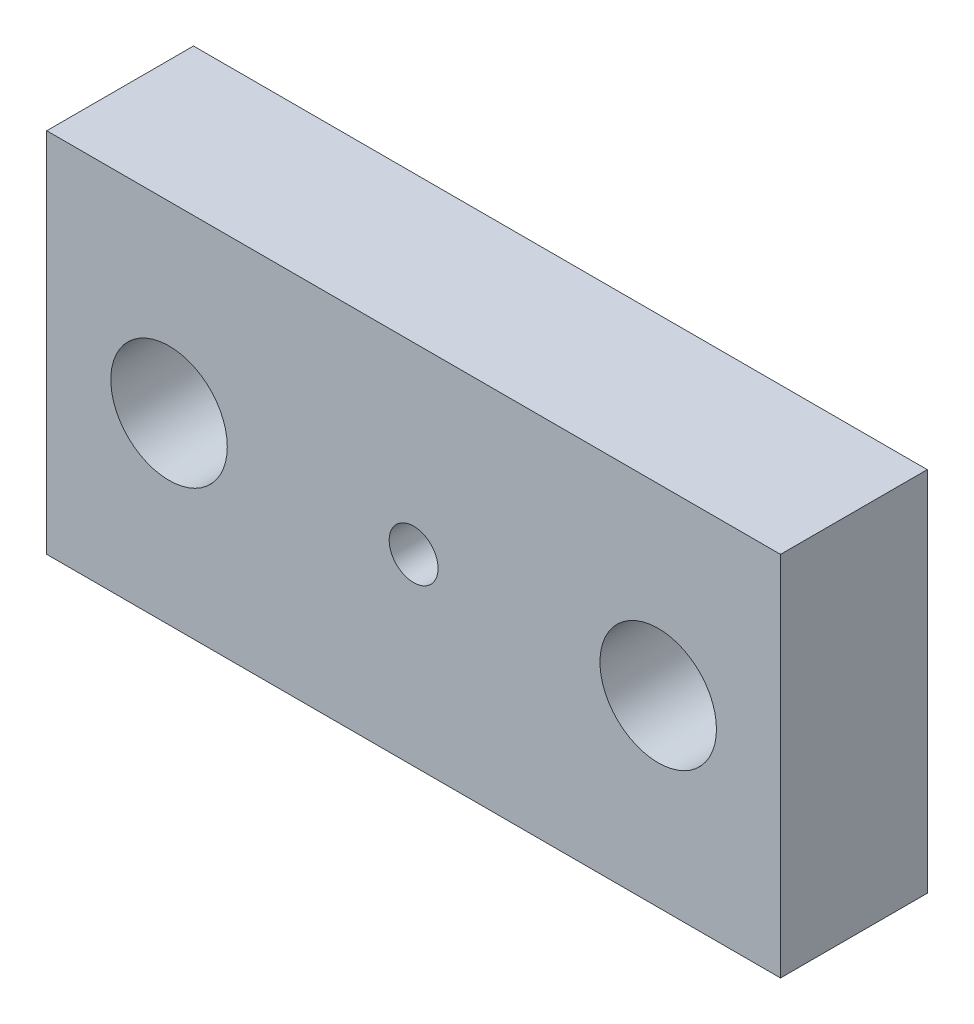
ISO-10303-21;
HEADER;
FILE_DESCRIPTION(('STEP AP214'),'2;1');
FILE_NAME('part.step','',(''),(''),'','','');
FILE_SCHEMA(('AUTOMOTIVE_DESIGN { 1 0 10303 214 1 1 1 1 }'));
ENDSEC;
DATA;
#1=APPLICATION_CONTEXT('core data for automotive mechanical design processes');
#2=APPLICATION_PROTOCOL_DEFINITION('international standard','automotive_design',2000,#1);
#3=PRODUCT_CONTEXT('',#1,'mechanical');
#4=PRODUCT('Part','Part','',(#3));
#5=PRODUCT_RELATED_PRODUCT_CATEGORY('part','',(#4));
#6=PRODUCT_DEFINITION_FORMATION('','',#4);
#7=PRODUCT_DEFINITION_CONTEXT('part definition',#1,'design');
#8=PRODUCT_DEFINITION('design','',#6,#7);
#9=PRODUCT_DEFINITION_SHAPE('','',#8);
#10=(LENGTH_UNIT() NAMED_UNIT(*) SI_UNIT(.MILLI.,.METRE.));
#11=(NAMED_UNIT(*) PLANE_ANGLE_UNIT() SI_UNIT($,.RADIAN.));
#12=(NAMED_UNIT(*) SI_UNIT($,.STERADIAN.) SOLID_ANGLE_UNIT());
#13=UNCERTAINTY_MEASURE_WITH_UNIT(LENGTH_MEASURE(1.E-05),#10,'distance_accuracy_value','');
#14=(GEOMETRIC_REPRESENTATION_CONTEXT(3) GLOBAL_UNCERTAINTY_ASSIGNED_CONTEXT((#13)) GLOBAL_UNIT_ASSIGNED_CONTEXT((#10,
#11,#12)) REPRESENTATION_CONTEXT('',''));
#15=CARTESIAN_POINT('',(0.,0.,0.));
#16=DIRECTION('',(0.,0.,1.));
#17=DIRECTION('',(1.,0.,0.));
#18=AXIS2_PLACEMENT_3D('',#15,#16,#17);
#19=CARTESIAN_POINT('',(0.,0.,6.));
#20=DIRECTION('',(0.,0.,-1.));
#21=DIRECTION('',(-1.,0.,0.));
#22=AXIS2_PLACEMENT_3D('',#19,#20,#21);
#23=CYLINDRICAL_SURFACE('',#22,1.);
#24=CARTESIAN_POINT('',(0.,0.,6.));
#25=DIRECTION('',(0.,0.,1.));
#26=DIRECTION('',(1.,0.,0.));
#27=AXIS2_PLACEMENT_3D('',#24,#25,#26);
#28=CIRCLE('',#27,1.);
#29=CARTESIAN_POINT('',(0.999999999999993,0.,6.));
#30=VERTEX_POINT('',#29);
#31=EDGE_CURVE('E106',#30,#30,#28,.T.);
#32=ORIENTED_EDGE('',*,*,#31,.T.);
#33=EDGE_LOOP('',(#32));
#34=FACE_BOUND('',#33,.T.);
#35=CARTESIAN_POINT('',(0.,0.,3.));
#36=DIRECTION('',(0.,0.,-1.));
#37=DIRECTION('',(-1.,0.,0.));
#38=AXIS2_PLACEMENT_3D('',#35,#36,#37);
#39=CIRCLE('',#38,1.);
#40=CARTESIAN_POINT('',(-1.00000000000001,0.,3.));
#41=VERTEX_POINT('',#40);
#42=EDGE_CURVE('E40',#41,#41,#39,.T.);
#43=ORIENTED_EDGE('',*,*,#42,.T.);
#44=EDGE_LOOP('',(#43));
#45=FACE_BOUND('',#44,.T.);
#46=ADVANCED_FACE('F36',(#34,#45),#23,.F.);
#47=CARTESIAN_POINT('',(0.,0.,6.));
#48=DIRECTION('',(0.,0.,-1.));
#49=DIRECTION('',(-1.,0.,0.));
#50=AXIS2_PLACEMENT_3D('',#47,#48,#49);
#51=PLANE('',#50);
#52=DIRECTION('',(0.,1.,0.));
#53=VECTOR('',#52,1.);
#54=CARTESIAN_POINT('',(15.,-7.5,6.));
#55=LINE('',#54,#53);
#56=CARTESIAN_POINT('',(15.,-7.5,6.));
#57=VERTEX_POINT('',#56);
#58=CARTESIAN_POINT('',(15.,7.5,6.));
#59=VERTEX_POINT('',#58);
#60=EDGE_CURVE('E90',#57,#59,#55,.T.);
#61=ORIENTED_EDGE('',*,*,#60,.T.);
#62=DIRECTION('',(-1.,0.,0.));
#63=VECTOR('',#62,1.);
#64=CARTESIAN_POINT('',(-15.,7.5,6.));
#65=LINE('',#64,#63);
#66=CARTESIAN_POINT('',(-15.,7.5,6.));
#67=VERTEX_POINT('',#66);
#68=EDGE_CURVE('E84',#59,#67,#65,.T.);
#69=ORIENTED_EDGE('',*,*,#68,.T.);
#70=DIRECTION('',(0.,-1.,0.));
#71=VECTOR('',#70,1.);
#72=CARTESIAN_POINT('',(-15.,-7.5,6.));
#73=LINE('',#72,#71);
#74=CARTESIAN_POINT('',(-15.,-7.5,6.));
#75=VERTEX_POINT('',#74);
#76=EDGE_CURVE('E88',#67,#75,#73,.T.);
#77=ORIENTED_EDGE('',*,*,#76,.T.);
#78=DIRECTION('',(1.,0.,0.));
#79=VECTOR('',#78,1.);
#80=CARTESIAN_POINT('',(-15.,-7.5,6.));
#81=LINE('',#80,#79);
#82=EDGE_CURVE('E54',#75,#57,#81,.T.);
#83=ORIENTED_EDGE('',*,*,#82,.T.);
#84=EDGE_LOOP('',(#61,#69,#77,#83));
#85=FACE_BOUND('',#84,.T.);
#86=ORIENTED_EDGE('',*,*,#31,.F.);
#87=EDGE_LOOP('',(#86));
#88=FACE_BOUND('',#87,.T.);
#89=CARTESIAN_POINT('',(10.,0.,6.));
#90=DIRECTION('',(0.,0.,1.));
#91=DIRECTION('',(1.,0.,0.));
#92=AXIS2_PLACEMENT_3D('',#89,#90,#91);
#93=CIRCLE('',#92,2.38125);
#94=CARTESIAN_POINT('',(12.38125,0.,6.));
#95=VERTEX_POINT('',#94);
#96=EDGE_CURVE('E120',#95,#95,#93,.T.);
#97=ORIENTED_EDGE('',*,*,#96,.F.);
#98=EDGE_LOOP('',(#97));
#99=FACE_BOUND('',#98,.T.);
#100=CARTESIAN_POINT('',(-10.,0.,6.));
#101=DIRECTION('',(0.,0.,1.));
#102=DIRECTION('',(1.,0.,0.));
#103=AXIS2_PLACEMENT_3D('',#100,#101,#102);
#104=CIRCLE('',#103,2.38125);
#105=CARTESIAN_POINT('',(-7.61875,0.,6.));
#106=VERTEX_POINT('',#105);
#107=EDGE_CURVE('E124',#106,#106,#104,.T.);
#108=ORIENTED_EDGE('',*,*,#107,.F.);
#109=EDGE_LOOP('',(#108));
#110=FACE_BOUND('',#109,.T.);
#111=ADVANCED_FACE('F85',(#85,#88,#99,#110),#51,.F.);
#112=CARTESIAN_POINT('',(0.,0.,0.));
#113=DIRECTION('',(0.,0.,-1.));
#114=DIRECTION('',(-1.,0.,0.));
#115=AXIS2_PLACEMENT_3D('',#112,#113,#114);
#116=PLANE('',#115);
#117=CARTESIAN_POINT('',(0.,0.,0.));
#118=DIRECTION('',(0.,0.,-1.));
#119=DIRECTION('',(-1.,0.,0.));
#120=AXIS2_PLACEMENT_3D('',#117,#118,#119);
#121=CIRCLE('',#120,2.5);
#122=CARTESIAN_POINT('',(-2.5,0.,0.));
#123=VERTEX_POINT('',#122);
#124=EDGE_CURVE('E132',#123,#123,#121,.T.);
#125=ORIENTED_EDGE('',*,*,#124,.F.);
#126=EDGE_LOOP('',(#125));
#127=FACE_BOUND('',#126,.T.);
#128=CARTESIAN_POINT('',(10.,0.,0.));
#129=DIRECTION('',(0.,0.,1.));
#130=DIRECTION('',(1.,0.,0.));
#131=AXIS2_PLACEMENT_3D('',#128,#129,#130);
#132=CIRCLE('',#131,2.38125);
#133=CARTESIAN_POINT('',(12.38125,0.,0.));
#134=VERTEX_POINT('',#133);
#135=EDGE_CURVE('E121',#134,#134,#132,.T.);
#136=ORIENTED_EDGE('',*,*,#135,.T.);
#137=EDGE_LOOP('',(#136));
#138=FACE_BOUND('',#137,.T.);
#139=DIRECTION('',(0.,1.,0.));
#140=VECTOR('',#139,1.);
#141=CARTESIAN_POINT('',(15.,-7.5,0.));
#142=LINE('',#141,#140);
#143=CARTESIAN_POINT('',(15.,-7.5,0.));
#144=VERTEX_POINT('',#143);
#145=CARTESIAN_POINT('',(15.,7.5,0.));
#146=VERTEX_POINT('',#145);
#147=EDGE_CURVE('E103',#144,#146,#142,.T.);
#148=ORIENTED_EDGE('',*,*,#147,.F.);
#149=DIRECTION('',(1.,0.,0.));
#150=VECTOR('',#149,1.);
#151=CARTESIAN_POINT('',(-15.,-7.5,0.));
#152=LINE('',#151,#150);
#153=CARTESIAN_POINT('',(-15.,-7.5,0.));
#154=VERTEX_POINT('',#153);
#155=EDGE_CURVE('E77',#154,#144,#152,.T.);
#156=ORIENTED_EDGE('',*,*,#155,.F.);
#157=DIRECTION('',(0.,-1.,0.));
#158=VECTOR('',#157,1.);
#159=CARTESIAN_POINT('',(-15.,-7.5,0.));
#160=LINE('',#159,#158);
#161=CARTESIAN_POINT('',(-15.,7.5,0.));
#162=VERTEX_POINT('',#161);
#163=EDGE_CURVE('E71',#162,#154,#160,.T.);
#164=ORIENTED_EDGE('',*,*,#163,.F.);
#165=DIRECTION('',(-1.,0.,0.));
#166=VECTOR('',#165,1.);
#167=CARTESIAN_POINT('',(-15.,7.5,0.));
#168=LINE('',#167,#166);
#169=EDGE_CURVE('E94',#146,#162,#168,.T.);
#170=ORIENTED_EDGE('',*,*,#169,.F.);
#171=EDGE_LOOP('',(#148,#156,#164,#170));
#172=FACE_BOUND('',#171,.T.);
#173=CARTESIAN_POINT('',(-10.,0.,0.));
#174=DIRECTION('',(0.,0.,1.));
#175=DIRECTION('',(1.,0.,0.));
#176=AXIS2_PLACEMENT_3D('',#173,#174,#175);
#177=CIRCLE('',#176,2.38125);
#178=CARTESIAN_POINT('',(-7.61875,0.,0.));
#179=VERTEX_POINT('',#178);
#180=EDGE_CURVE('E127',#179,#179,#177,.T.);
#181=ORIENTED_EDGE('',*,*,#180,.T.);
#182=EDGE_LOOP('',(#181));
#183=FACE_BOUND('',#182,.T.);
#184=ADVANCED_FACE('F114',(#127,#138,#172,#183),#116,.T.);
#185=CARTESIAN_POINT('',(15.,-7.5,6.));
#186=DIRECTION('',(-1.,0.,0.));
#187=DIRECTION('',(0.,0.,1.));
#188=AXIS2_PLACEMENT_3D('',#185,#186,#187);
#189=PLANE('',#188);
#190=ORIENTED_EDGE('',*,*,#147,.T.);
#191=DIRECTION('',(0.,0.,-1.));
#192=VECTOR('',#191,1.);
#193=CARTESIAN_POINT('',(15.,7.5,6.));
#194=LINE('',#193,#192);
#195=EDGE_CURVE('E11',#59,#146,#194,.T.);
#196=ORIENTED_EDGE('',*,*,#195,.F.);
#197=ORIENTED_EDGE('',*,*,#60,.F.);
#198=DIRECTION('',(0.,0.,-1.));
#199=VECTOR('',#198,1.);
#200=CARTESIAN_POINT('',(15.,-7.5,6.));
#201=LINE('',#200,#199);
#202=EDGE_CURVE('E99',#57,#144,#201,.T.);
#203=ORIENTED_EDGE('',*,*,#202,.T.);
#204=EDGE_LOOP('',(#190,#196,#197,#203));
#205=FACE_BOUND('',#204,.T.);
#206=ADVANCED_FACE('F38',(#205),#189,.F.);
#207=CARTESIAN_POINT('',(-15.,7.5,6.));
#208=DIRECTION('',(0.,-1.,0.));
#209=DIRECTION('',(0.,0.,-1.));
#210=AXIS2_PLACEMENT_3D('',#207,#208,#209);
#211=PLANE('',#210);
#212=ORIENTED_EDGE('',*,*,#169,.T.);
#213=DIRECTION('',(0.,0.,-1.));
#214=VECTOR('',#213,1.);
#215=CARTESIAN_POINT('',(-15.,7.5,6.));
#216=LINE('',#215,#214);
#217=EDGE_CURVE('E46',#67,#162,#216,.T.);
#218=ORIENTED_EDGE('',*,*,#217,.F.);
#219=ORIENTED_EDGE('',*,*,#68,.F.);
#220=ORIENTED_EDGE('',*,*,#195,.T.);
#221=EDGE_LOOP('',(#212,#218,#219,#220));
#222=FACE_BOUND('',#221,.T.);
#223=ADVANCED_FACE('F93',(#222),#211,.F.);
#224=CARTESIAN_POINT('',(-15.,-7.5,6.));
#225=DIRECTION('',(1.,0.,0.));
#226=DIRECTION('',(0.,0.,-1.));
#227=AXIS2_PLACEMENT_3D('',#224,#225,#226);
#228=PLANE('',#227);
#229=ORIENTED_EDGE('',*,*,#163,.T.);
#230=DIRECTION('',(0.,0.,-1.));
#231=VECTOR('',#230,1.);
#232=CARTESIAN_POINT('',(-15.,-7.5,6.));
#233=LINE('',#232,#231);
#234=EDGE_CURVE('E95',#75,#154,#233,.T.);
#235=ORIENTED_EDGE('',*,*,#234,.F.);
#236=ORIENTED_EDGE('',*,*,#76,.F.);
#237=ORIENTED_EDGE('',*,*,#217,.T.);
#238=EDGE_LOOP('',(#229,#235,#236,#237));
#239=FACE_BOUND('',#238,.T.);
#240=ADVANCED_FACE('F97',(#239),#228,.F.);
#241=CARTESIAN_POINT('',(-15.,-7.5,6.));
#242=DIRECTION('',(0.,1.,0.));
#243=DIRECTION('',(0.,0.,1.));
#244=AXIS2_PLACEMENT_3D('',#241,#242,#243);
#245=PLANE('',#244);
#246=ORIENTED_EDGE('',*,*,#155,.T.);
#247=ORIENTED_EDGE('',*,*,#202,.F.);
#248=ORIENTED_EDGE('',*,*,#82,.F.);
#249=ORIENTED_EDGE('',*,*,#234,.T.);
#250=EDGE_LOOP('',(#246,#247,#248,#249));
#251=FACE_BOUND('',#250,.T.);
#252=ADVANCED_FACE('F111',(#251),#245,.F.);
#253=CARTESIAN_POINT('',(10.,0.,6.));
#254=DIRECTION('',(0.,0.,-1.));
#255=DIRECTION('',(-1.,0.,0.));
#256=AXIS2_PLACEMENT_3D('',#253,#254,#255);
#257=CYLINDRICAL_SURFACE('',#256,2.38125);
#258=ORIENTED_EDGE('',*,*,#96,.T.);
#259=EDGE_LOOP('',(#258));
#260=FACE_BOUND('',#259,.T.);
#261=ORIENTED_EDGE('',*,*,#135,.F.);
#262=EDGE_LOOP('',(#261));
#263=FACE_BOUND('',#262,.T.);
#264=ADVANCED_FACE('F161',(#260,#263),#257,.F.);
#265=CARTESIAN_POINT('',(-10.,0.,6.));
#266=DIRECTION('',(0.,0.,-1.));
#267=DIRECTION('',(-1.,0.,0.));
#268=AXIS2_PLACEMENT_3D('',#265,#266,#267);
#269=CYLINDRICAL_SURFACE('',#268,2.38125);
#270=ORIENTED_EDGE('',*,*,#107,.T.);
#271=EDGE_LOOP('',(#270));
#272=FACE_BOUND('',#271,.T.);
#273=ORIENTED_EDGE('',*,*,#180,.F.);
#274=EDGE_LOOP('',(#273));
#275=FACE_BOUND('',#274,.T.);
#276=ADVANCED_FACE('F150',(#272,#275),#269,.F.);
#277=CARTESIAN_POINT('',(0.,0.,3.));
#278=DIRECTION('',(0.,0.,-1.));
#279=DIRECTION('',(-1.,0.,0.));
#280=AXIS2_PLACEMENT_3D('',#277,#278,#279);
#281=CYLINDRICAL_SURFACE('',#280,2.5);
#282=CARTESIAN_POINT('',(0.,0.,3.));
#283=DIRECTION('',(0.,0.,-1.));
#284=DIRECTION('',(-1.,0.,0.));
#285=AXIS2_PLACEMENT_3D('',#282,#283,#284);
#286=CIRCLE('',#285,2.5);
#287=CARTESIAN_POINT('',(-2.5,0.,3.));
#288=VERTEX_POINT('',#287);
#289=EDGE_CURVE('E135',#288,#288,#286,.T.);
#290=ORIENTED_EDGE('',*,*,#289,.F.);
#291=EDGE_LOOP('',(#290));
#292=FACE_BOUND('',#291,.T.);
#293=ORIENTED_EDGE('',*,*,#124,.T.);
#294=EDGE_LOOP('',(#293));
#295=FACE_BOUND('',#294,.T.);
#296=ADVANCED_FACE('F145',(#292,#295),#281,.F.);
#297=CARTESIAN_POINT('',(0.,0.,3.));
#298=DIRECTION('',(0.,0.,-1.));
#299=DIRECTION('',(-1.,0.,0.));
#300=AXIS2_PLACEMENT_3D('',#297,#298,#299);
#301=PLANE('',#300);
#302=ORIENTED_EDGE('',*,*,#42,.F.);
#303=EDGE_LOOP('',(#302));
#304=FACE_BOUND('',#303,.T.);
#305=ORIENTED_EDGE('',*,*,#289,.T.);
#306=EDGE_LOOP('',(#305));
#307=FACE_BOUND('',#306,.T.);
#308=ADVANCED_FACE('F143',(#304,#307),#301,.T.);
#309=CLOSED_SHELL('',(#46,#111,#184,#206,#223,#240,#252,#264,#276,#296,#308));
#310=MANIFOLD_SOLID_BREP('B2',#309);
#311=ADVANCED_BREP_SHAPE_REPRESENTATION('',(#18,#310),#14);
#312=SHAPE_DEFINITION_REPRESENTATION(#9,#311);
ENDSEC;
END-ISO-10303-21;
